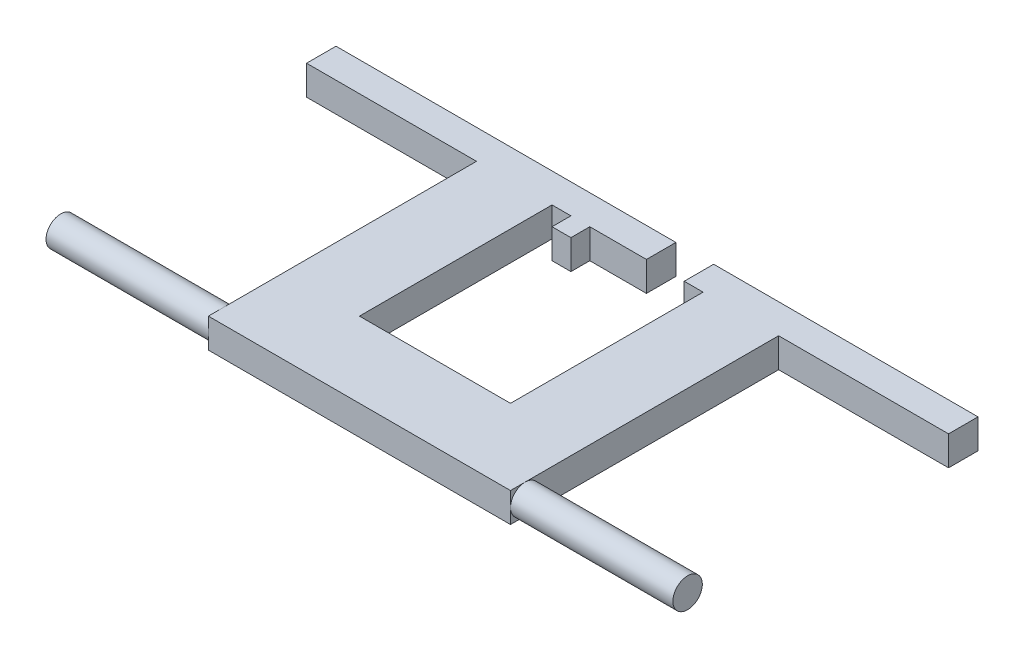
ISO-10303-21;
HEADER;
FILE_DESCRIPTION(('STEP AP214'),'2;1');
FILE_NAME('part.step','',(''),(''),'','','');
FILE_SCHEMA(('AUTOMOTIVE_DESIGN { 1 0 10303 214 1 1 1 1 }'));
ENDSEC;
DATA;
#1=APPLICATION_CONTEXT('core data for automotive mechanical design processes');
#2=APPLICATION_PROTOCOL_DEFINITION('international standard','automotive_design',2000,#1);
#3=PRODUCT_CONTEXT('',#1,'mechanical');
#4=PRODUCT('Part','Part','',(#3));
#5=PRODUCT_RELATED_PRODUCT_CATEGORY('part','',(#4));
#6=PRODUCT_DEFINITION_FORMATION('','',#4);
#7=PRODUCT_DEFINITION_CONTEXT('part definition',#1,'design');
#8=PRODUCT_DEFINITION('design','',#6,#7);
#9=PRODUCT_DEFINITION_SHAPE('','',#8);
#10=(LENGTH_UNIT() NAMED_UNIT(*) SI_UNIT(.MILLI.,.METRE.));
#11=(NAMED_UNIT(*) PLANE_ANGLE_UNIT() SI_UNIT($,.RADIAN.));
#12=(NAMED_UNIT(*) SI_UNIT($,.STERADIAN.) SOLID_ANGLE_UNIT());
#13=UNCERTAINTY_MEASURE_WITH_UNIT(LENGTH_MEASURE(1.E-05),#10,'distance_accuracy_value','');
#14=(GEOMETRIC_REPRESENTATION_CONTEXT(3) GLOBAL_UNCERTAINTY_ASSIGNED_CONTEXT((#13)) GLOBAL_UNIT_ASSIGNED_CONTEXT((#10,
#11,#12)) REPRESENTATION_CONTEXT('',''));
#15=CARTESIAN_POINT('',(0.,0.,0.));
#16=DIRECTION('',(0.,0.,1.));
#17=DIRECTION('',(1.,0.,0.));
#18=AXIS2_PLACEMENT_3D('',#15,#16,#17);
#19=CARTESIAN_POINT('',(-75.2631578947368,7.8,-5.25519897304235));
#20=DIRECTION('',(0.,0.,-1.));
#21=DIRECTION('',(-1.,0.,0.));
#22=AXIS2_PLACEMENT_3D('',#19,#20,#21);
#23=PLANE('',#22);
#24=DIRECTION('',(0.,-1.,0.));
#25=VECTOR('',#24,1.);
#26=CARTESIAN_POINT('',(-5.26315789473683,7.8,-5.25519897304235));
#27=LINE('',#26,#25);
#28=CARTESIAN_POINT('',(-5.26315789473683,7.8,-5.25519897304235));
#29=VERTEX_POINT('',#28);
#30=CARTESIAN_POINT('',(-5.26315789473683,0.,-5.25519897304235));
#31=VERTEX_POINT('',#30);
#32=EDGE_CURVE('E63',#29,#31,#27,.T.);
#33=ORIENTED_EDGE('',*,*,#32,.F.);
#34=DIRECTION('',(1.,0.,0.));
#35=VECTOR('',#34,1.);
#36=CARTESIAN_POINT('',(-75.2631578947368,7.8,-5.25519897304235));
#37=LINE('',#36,#35);
#38=CARTESIAN_POINT('',(-10.2631578947368,7.8,-5.25519897304235));
#39=VERTEX_POINT('',#38);
#40=EDGE_CURVE('E370',#39,#29,#37,.T.);
#41=ORIENTED_EDGE('',*,*,#40,.F.);
#42=DIRECTION('',(0.,1.,0.));
#43=VECTOR('',#42,1.);
#44=CARTESIAN_POINT('',(-10.2631578947368,7.8,-5.25519897304235));
#45=LINE('',#44,#43);
#46=CARTESIAN_POINT('',(-10.2631578947368,0.,-5.25519897304235));
#47=VERTEX_POINT('',#46);
#48=EDGE_CURVE('E340',#47,#39,#45,.T.);
#49=ORIENTED_EDGE('',*,*,#48,.F.);
#50=DIRECTION('',(1.,0.,0.));
#51=VECTOR('',#50,1.);
#52=CARTESIAN_POINT('',(-75.2631578947368,0.,-5.25519897304235));
#53=LINE('',#52,#51);
#54=EDGE_CURVE('E388',#47,#31,#53,.T.);
#55=ORIENTED_EDGE('',*,*,#54,.T.);
#56=EDGE_LOOP('',(#33,#41,#49,#55));
#57=FACE_BOUND('',#56,.T.);
#58=ADVANCED_FACE('F39',(#57),#23,.F.);
#59=DIRECTION('',(0.,1.,0.));
#60=VECTOR('',#59,1.);
#61=CARTESIAN_POINT('',(-0.263157894736831,7.8,-5.25519897304235));
#62=LINE('',#61,#60);
#63=CARTESIAN_POINT('',(-0.26315789473683,0.,-5.25519897304235));
#64=VERTEX_POINT('',#63);
#65=CARTESIAN_POINT('',(-0.263157894736826,7.8,-5.25519897304235));
#66=VERTEX_POINT('',#65);
#67=EDGE_CURVE('E220',#64,#66,#62,.T.);
#68=ORIENTED_EDGE('',*,*,#67,.F.);
#69=CARTESIAN_POINT('',(14.7368421052631,0.,-5.25519897304235));
#70=VERTEX_POINT('',#69);
#71=EDGE_CURVE('E389',#64,#70,#53,.T.);
#72=ORIENTED_EDGE('',*,*,#71,.T.);
#73=DIRECTION('',(0.,-1.,0.));
#74=VECTOR('',#73,1.);
#75=CARTESIAN_POINT('',(14.7368421052631,7.8,-5.25519897304235));
#76=LINE('',#75,#74);
#77=CARTESIAN_POINT('',(14.7368421052631,7.8,-5.25519897304235));
#78=VERTEX_POINT('',#77);
#79=EDGE_CURVE('E224',#78,#70,#76,.T.);
#80=ORIENTED_EDGE('',*,*,#79,.F.);
#81=EDGE_CURVE('E55',#66,#78,#37,.T.);
#82=ORIENTED_EDGE('',*,*,#81,.F.);
#83=EDGE_LOOP('',(#68,#72,#80,#82));
#84=FACE_BOUND('',#83,.T.);
#85=ADVANCED_FACE('F436',(#84),#23,.F.);
#86=CARTESIAN_POINT('',(-75.2631578947368,7.8,-13.0551989730424));
#87=DIRECTION('',(0.,0.,1.));
#88=DIRECTION('',(1.,0.,0.));
#89=AXIS2_PLACEMENT_3D('',#86,#87,#88);
#90=PLANE('',#89);
#91=DIRECTION('',(-1.,0.,0.));
#92=VECTOR('',#91,1.);
#93=CARTESIAN_POINT('',(-75.2631578947368,7.8,-13.0551989730424));
#94=LINE('',#93,#92);
#95=CARTESIAN_POINT('',(14.7368421052631,7.8,-13.0551989730424));
#96=VERTEX_POINT('',#95);
#97=CARTESIAN_POINT('',(-75.2631578947368,7.8,-13.0551989730424));
#98=VERTEX_POINT('',#97);
#99=EDGE_CURVE('E373',#96,#98,#94,.T.);
#100=ORIENTED_EDGE('',*,*,#99,.F.);
#101=DIRECTION('',(0.,-1.,0.));
#102=VECTOR('',#101,1.);
#103=CARTESIAN_POINT('',(14.7368421052631,7.8,-13.0551989730424));
#104=LINE('',#103,#102);
#105=CARTESIAN_POINT('',(14.7368421052631,0.,-13.0551989730424));
#106=VERTEX_POINT('',#105);
#107=EDGE_CURVE('E235',#96,#106,#104,.T.);
#108=ORIENTED_EDGE('',*,*,#107,.T.);
#109=DIRECTION('',(-1.,0.,0.));
#110=VECTOR('',#109,1.);
#111=CARTESIAN_POINT('',(-75.2631578947368,0.,-13.0551989730424));
#112=LINE('',#111,#110);
#113=CARTESIAN_POINT('',(-75.2631578947368,0.,-13.0551989730424));
#114=VERTEX_POINT('',#113);
#115=EDGE_CURVE('E392',#106,#114,#112,.T.);
#116=ORIENTED_EDGE('',*,*,#115,.T.);
#117=DIRECTION('',(0.,-1.,0.));
#118=VECTOR('',#117,1.);
#119=CARTESIAN_POINT('',(-75.2631578947368,7.8,-13.0551989730424));
#120=LINE('',#119,#118);
#121=EDGE_CURVE('E378',#98,#114,#120,.T.);
#122=ORIENTED_EDGE('',*,*,#121,.F.);
#123=EDGE_LOOP('',(#100,#108,#116,#122));
#124=FACE_BOUND('',#123,.T.);
#125=ADVANCED_FACE('F487',(#124),#90,.F.);
#126=CARTESIAN_POINT('',(49.7368421052635,7.8,65.7448010269574));
#127=DIRECTION('',(1.,0.,0.));
#128=DIRECTION('',(0.,0.,-1.));
#129=AXIS2_PLACEMENT_3D('',#126,#127,#128);
#130=PLANE('',#129);
#131=CARTESIAN_POINT('',(49.7368421052635,3.9,61.8448010269574));
#132=DIRECTION('',(-1.,0.,0.));
#133=DIRECTION('',(0.,0.,1.));
#134=AXIS2_PLACEMENT_3D('',#131,#132,#133);
#135=CIRCLE('',#134,3.9);
#136=CARTESIAN_POINT('',(49.7368421052635,3.9,65.7448010269574));
#137=VERTEX_POINT('',#136);
#138=CARTESIAN_POINT('',(49.7368421052635,7.8,61.8448010269574));
#139=VERTEX_POINT('',#138);
#140=EDGE_CURVE('E270',#137,#139,#135,.T.);
#141=ORIENTED_EDGE('',*,*,#140,.T.);
#142=DIRECTION('',(0.,0.,-1.));
#143=VECTOR('',#142,1.);
#144=CARTESIAN_POINT('',(49.7368421052635,7.8,65.7448010269574));
#145=LINE('',#144,#143);
#146=CARTESIAN_POINT('',(49.7368421052635,7.8,65.7448010269574));
#147=VERTEX_POINT('',#146);
#148=EDGE_CURVE('E301',#147,#139,#145,.T.);
#149=ORIENTED_EDGE('',*,*,#148,.F.);
#150=DIRECTION('',(0.,-1.,0.));
#151=VECTOR('',#150,1.);
#152=CARTESIAN_POINT('',(49.7368421052635,7.8,65.7448010269574));
#153=LINE('',#152,#151);
#154=EDGE_CURVE('E275',#147,#137,#153,.T.);
#155=ORIENTED_EDGE('',*,*,#154,.T.);
#156=EDGE_LOOP('',(#141,#149,#155));
#157=FACE_BOUND('',#156,.T.);
#158=ADVANCED_FACE('F466',(#157),#130,.T.);
#159=CARTESIAN_POINT('',(49.7368421052635,0.,61.8448010269574));
#160=VERTEX_POINT('',#159);
#161=EDGE_CURVE('E264',#160,#137,#135,.T.);
#162=ORIENTED_EDGE('',*,*,#161,.T.);
#163=CARTESIAN_POINT('',(49.7368421052635,0.,65.7448010269574));
#164=VERTEX_POINT('',#163);
#165=EDGE_CURVE('E280',#137,#164,#153,.T.);
#166=ORIENTED_EDGE('',*,*,#165,.T.);
#167=DIRECTION('',(0.,0.,-1.));
#168=VECTOR('',#167,1.);
#169=CARTESIAN_POINT('',(49.7368421052635,0.,65.7448010269574));
#170=LINE('',#169,#168);
#171=EDGE_CURVE('E288',#164,#160,#170,.T.);
#172=ORIENTED_EDGE('',*,*,#171,.T.);
#173=EDGE_LOOP('',(#162,#166,#172));
#174=FACE_BOUND('',#173,.T.);
#175=ADVANCED_FACE('F457',(#174),#130,.T.);
#176=CARTESIAN_POINT('',(49.7368421052632,7.8,-5.25519897304235));
#177=VERTEX_POINT('',#176);
#178=CARTESIAN_POINT('',(94.7368421052632,7.8,-5.25519897304235));
#179=VERTEX_POINT('',#178);
#180=EDGE_CURVE('E363',#177,#179,#37,.T.);
#181=ORIENTED_EDGE('',*,*,#180,.F.);
#182=DIRECTION('',(0.,-1.,0.));
#183=VECTOR('',#182,1.);
#184=CARTESIAN_POINT('',(49.7368421052632,7.8,-5.25519897304255));
#185=LINE('',#184,#183);
#186=CARTESIAN_POINT('',(49.7368421052632,0.,-5.25519897304255));
#187=VERTEX_POINT('',#186);
#188=EDGE_CURVE('E269',#177,#187,#185,.T.);
#189=ORIENTED_EDGE('',*,*,#188,.T.);
#190=CARTESIAN_POINT('',(94.7368421052632,0.,-5.25519897304235));
#191=VERTEX_POINT('',#190);
#192=EDGE_CURVE('E382',#187,#191,#53,.T.);
#193=ORIENTED_EDGE('',*,*,#192,.T.);
#194=DIRECTION('',(0.,-1.,0.));
#195=VECTOR('',#194,1.);
#196=CARTESIAN_POINT('',(94.7368421052632,7.8,-5.25519897304235));
#197=LINE('',#196,#195);
#198=EDGE_CURVE('E48',#179,#191,#197,.T.);
#199=ORIENTED_EDGE('',*,*,#198,.F.);
#200=EDGE_LOOP('',(#181,#189,#193,#199));
#201=FACE_BOUND('',#200,.T.);
#202=ADVANCED_FACE('F444',(#201),#23,.F.);
#203=CARTESIAN_POINT('',(-10.2631578947368,7.8,65.7448010269576));
#204=DIRECTION('',(-1.,0.,0.));
#205=DIRECTION('',(0.,-1.,0.));
#206=AXIS2_PLACEMENT_3D('',#203,#204,#205);
#207=PLANE('',#206);
#208=DIRECTION('',(0.,1.,0.));
#209=VECTOR('',#208,1.);
#210=CARTESIAN_POINT('',(-10.2631578947368,7.8,45.7448010269576));
#211=LINE('',#210,#209);
#212=CARTESIAN_POINT('',(-10.2631578947368,0.,45.7448010269576));
#213=VERTEX_POINT('',#212);
#214=CARTESIAN_POINT('',(-10.2631578947368,7.8,45.7448010269576));
#215=VERTEX_POINT('',#214);
#216=EDGE_CURVE('E304',#213,#215,#211,.T.);
#217=ORIENTED_EDGE('',*,*,#216,.F.);
#218=DIRECTION('',(0.,0.,-1.));
#219=VECTOR('',#218,1.);
#220=CARTESIAN_POINT('',(-10.2631578947368,0.,65.7448010269576));
#221=LINE('',#220,#219);
#222=EDGE_CURVE('E351',#213,#47,#221,.T.);
#223=ORIENTED_EDGE('',*,*,#222,.T.);
#224=ORIENTED_EDGE('',*,*,#48,.T.);
#225=DIRECTION('',(0.,0.,-1.));
#226=VECTOR('',#225,1.);
#227=CARTESIAN_POINT('',(-10.2631578947368,7.8,65.7448010269576));
#228=LINE('',#227,#226);
#229=EDGE_CURVE('E348',#215,#39,#228,.T.);
#230=ORIENTED_EDGE('',*,*,#229,.F.);
#231=EDGE_LOOP('',(#217,#223,#224,#230));
#232=FACE_BOUND('',#231,.T.);
#233=ADVANCED_FACE('F527',(#232),#207,.F.);
#234=CARTESIAN_POINT('',(-30.2631578947368,7.8,65.7448010269576));
#235=DIRECTION('',(1.,0.,0.));
#236=DIRECTION('',(0.,0.,-1.));
#237=AXIS2_PLACEMENT_3D('',#234,#235,#236);
#238=PLANE('',#237);
#239=CARTESIAN_POINT('',(-30.2631578947368,3.9,61.8448010269576));
#240=DIRECTION('',(-1.,0.,0.));
#241=DIRECTION('',(0.,0.,1.));
#242=AXIS2_PLACEMENT_3D('',#239,#240,#241);
#243=CIRCLE('',#242,3.9);
#244=CARTESIAN_POINT('',(-30.2631578947368,0.,61.8448010269576));
#245=VERTEX_POINT('',#244);
#246=CARTESIAN_POINT('',(-30.2631578947368,3.9,65.7448010269576));
#247=VERTEX_POINT('',#246);
#248=EDGE_CURVE('E314',#245,#247,#243,.T.);
#249=ORIENTED_EDGE('',*,*,#248,.F.);
#250=DIRECTION('',(0.,0.,-1.));
#251=VECTOR('',#250,1.);
#252=CARTESIAN_POINT('',(-30.2631578947368,0.,65.7448010269576));
#253=LINE('',#252,#251);
#254=CARTESIAN_POINT('',(-30.2631578947368,0.,65.7448010269576));
#255=VERTEX_POINT('',#254);
#256=EDGE_CURVE('E355',#255,#245,#253,.T.);
#257=ORIENTED_EDGE('',*,*,#256,.F.);
#258=DIRECTION('',(0.,-1.,0.));
#259=VECTOR('',#258,1.);
#260=CARTESIAN_POINT('',(-30.2631578947368,7.8,65.7448010269576));
#261=LINE('',#260,#259);
#262=EDGE_CURVE('E330',#247,#255,#261,.T.);
#263=ORIENTED_EDGE('',*,*,#262,.F.);
#264=EDGE_LOOP('',(#249,#257,#263));
#265=FACE_BOUND('',#264,.T.);
#266=ADVANCED_FACE('F497',(#265),#238,.F.);
#267=CARTESIAN_POINT('',(-30.2631578947368,7.8,61.8448010269576));
#268=VERTEX_POINT('',#267);
#269=EDGE_CURVE('E320',#247,#268,#243,.T.);
#270=ORIENTED_EDGE('',*,*,#269,.F.);
#271=CARTESIAN_POINT('',(-30.2631578947368,7.8,65.7448010269576));
#272=VERTEX_POINT('',#271);
#273=EDGE_CURVE('E325',#272,#247,#261,.T.);
#274=ORIENTED_EDGE('',*,*,#273,.F.);
#275=DIRECTION('',(0.,0.,-1.));
#276=VECTOR('',#275,1.);
#277=CARTESIAN_POINT('',(-30.2631578947368,7.8,65.7448010269576));
#278=LINE('',#277,#276);
#279=EDGE_CURVE('E344',#272,#268,#278,.T.);
#280=ORIENTED_EDGE('',*,*,#279,.T.);
#281=EDGE_LOOP('',(#270,#274,#280));
#282=FACE_BOUND('',#281,.T.);
#283=ADVANCED_FACE('F491',(#282),#238,.F.);
#284=DIRECTION('',(0.,-1.,0.));
#285=VECTOR('',#284,1.);
#286=CARTESIAN_POINT('',(-30.2631578947368,7.8,-5.25519897304235));
#287=LINE('',#286,#285);
#288=CARTESIAN_POINT('',(-30.2631578947368,7.8,-5.25519897304235));
#289=VERTEX_POINT('',#288);
#290=CARTESIAN_POINT('',(-30.2631578947368,0.,-5.25519897304235));
#291=VERTEX_POINT('',#290);
#292=EDGE_CURVE('E319',#289,#291,#287,.T.);
#293=ORIENTED_EDGE('',*,*,#292,.F.);
#294=CARTESIAN_POINT('',(-75.2631578947368,7.8,-5.25519897304235));
#295=VERTEX_POINT('',#294);
#296=EDGE_CURVE('E365',#295,#289,#37,.T.);
#297=ORIENTED_EDGE('',*,*,#296,.F.);
#298=DIRECTION('',(0.,-1.,0.));
#299=VECTOR('',#298,1.);
#300=CARTESIAN_POINT('',(-75.2631578947368,7.8,-5.25519897304235));
#301=LINE('',#300,#299);
#302=CARTESIAN_POINT('',(-75.2631578947368,0.,-5.25519897304235));
#303=VERTEX_POINT('',#302);
#304=EDGE_CURVE('E11',#295,#303,#301,.T.);
#305=ORIENTED_EDGE('',*,*,#304,.T.);
#306=EDGE_CURVE('E383',#303,#291,#53,.T.);
#307=ORIENTED_EDGE('',*,*,#306,.T.);
#308=EDGE_LOOP('',(#293,#297,#305,#307));
#309=FACE_BOUND('',#308,.T.);
#310=ADVANCED_FACE('F483',(#309),#23,.F.);
#311=CARTESIAN_POINT('',(24.7368421052631,7.8,-5.25519897304235));
#312=VERTEX_POINT('',#311);
#313=CARTESIAN_POINT('',(29.7368421052631,7.8,-5.25519897304235));
#314=VERTEX_POINT('',#313);
#315=EDGE_CURVE('E427',#312,#314,#37,.T.);
#316=ORIENTED_EDGE('',*,*,#315,.F.);
#317=DIRECTION('',(0.,1.,0.));
#318=VECTOR('',#317,1.);
#319=CARTESIAN_POINT('',(24.7368421052631,7.8,-5.25519897304235));
#320=LINE('',#319,#318);
#321=CARTESIAN_POINT('',(24.7368421052631,0.,-5.25519897304235));
#322=VERTEX_POINT('',#321);
#323=EDGE_CURVE('E229',#322,#312,#320,.T.);
#324=ORIENTED_EDGE('',*,*,#323,.F.);
#325=CARTESIAN_POINT('',(29.7368421052631,0.,-5.25519897304235));
#326=VERTEX_POINT('',#325);
#327=EDGE_CURVE('E438',#322,#326,#53,.T.);
#328=ORIENTED_EDGE('',*,*,#327,.T.);
#329=DIRECTION('',(0.,1.,0.));
#330=VECTOR('',#329,1.);
#331=CARTESIAN_POINT('',(29.7368421052632,7.8,-5.25519897304245));
#332=LINE('',#331,#330);
#333=EDGE_CURVE('E284',#326,#314,#332,.T.);
#334=ORIENTED_EDGE('',*,*,#333,.T.);
#335=EDGE_LOOP('',(#316,#324,#328,#334));
#336=FACE_BOUND('',#335,.T.);
#337=ADVANCED_FACE('F490',(#336),#23,.F.);
#338=CARTESIAN_POINT('',(-75.2631578947368,7.8,-13.0551989730424));
#339=DIRECTION('',(1.,0.,0.));
#340=DIRECTION('',(0.,0.,-1.));
#341=AXIS2_PLACEMENT_3D('',#338,#339,#340);
#342=PLANE('',#341);
#343=DIRECTION('',(0.,0.,1.));
#344=VECTOR('',#343,1.);
#345=CARTESIAN_POINT('',(-75.2631578947368,0.,-13.0551989730424));
#346=LINE('',#345,#344);
#347=EDGE_CURVE('E358',#114,#303,#346,.T.);
#348=ORIENTED_EDGE('',*,*,#347,.T.);
#349=ORIENTED_EDGE('',*,*,#304,.F.);
#350=DIRECTION('',(0.,0.,1.));
#351=VECTOR('',#350,1.);
#352=CARTESIAN_POINT('',(-75.2631578947368,7.8,-13.0551989730424));
#353=LINE('',#352,#351);
#354=EDGE_CURVE('E359',#98,#295,#353,.T.);
#355=ORIENTED_EDGE('',*,*,#354,.F.);
#356=ORIENTED_EDGE('',*,*,#121,.T.);
#357=EDGE_LOOP('',(#348,#349,#355,#356));
#358=FACE_BOUND('',#357,.T.);
#359=ADVANCED_FACE('F41',(#358),#342,.F.);
#360=CARTESIAN_POINT('',(94.7368421052632,7.8,-13.0551989730424));
#361=DIRECTION('',(-1.,0.,0.));
#362=DIRECTION('',(0.,0.,1.));
#363=AXIS2_PLACEMENT_3D('',#360,#361,#362);
#364=PLANE('',#363);
#365=DIRECTION('',(0.,0.,-1.));
#366=VECTOR('',#365,1.);
#367=CARTESIAN_POINT('',(94.7368421052632,0.,-13.0551989730424));
#368=LINE('',#367,#366);
#369=CARTESIAN_POINT('',(94.7368421052632,0.,-13.0551989730424));
#370=VERTEX_POINT('',#369);
#371=EDGE_CURVE('E387',#191,#370,#368,.T.);
#372=ORIENTED_EDGE('',*,*,#371,.T.);
#373=DIRECTION('',(0.,-1.,0.));
#374=VECTOR('',#373,1.);
#375=CARTESIAN_POINT('',(94.7368421052632,7.8,-13.0551989730424));
#376=LINE('',#375,#374);
#377=CARTESIAN_POINT('',(94.7368421052632,7.8,-13.0551989730424));
#378=VERTEX_POINT('',#377);
#379=EDGE_CURVE('E399',#378,#370,#376,.T.);
#380=ORIENTED_EDGE('',*,*,#379,.F.);
#381=DIRECTION('',(0.,0.,-1.));
#382=VECTOR('',#381,1.);
#383=CARTESIAN_POINT('',(94.7368421052632,7.8,-13.0551989730424));
#384=LINE('',#383,#382);
#385=EDGE_CURVE('E369',#179,#378,#384,.T.);
#386=ORIENTED_EDGE('',*,*,#385,.F.);
#387=ORIENTED_EDGE('',*,*,#198,.T.);
#388=EDGE_LOOP('',(#372,#380,#386,#387));
#389=FACE_BOUND('',#388,.T.);
#390=ADVANCED_FACE('F408',(#389),#364,.F.);
#391=CARTESIAN_POINT('',(24.7368421052631,0.,-13.0551989730424));
#392=VERTEX_POINT('',#391);
#393=EDGE_CURVE('E364',#370,#392,#112,.T.);
#394=ORIENTED_EDGE('',*,*,#393,.T.);
#395=DIRECTION('',(0.,1.,0.));
#396=VECTOR('',#395,1.);
#397=CARTESIAN_POINT('',(24.7368421052631,7.8,-13.0551989730424));
#398=LINE('',#397,#396);
#399=CARTESIAN_POINT('',(24.7368421052631,7.8,-13.0551989730424));
#400=VERTEX_POINT('',#399);
#401=EDGE_CURVE('E239',#392,#400,#398,.T.);
#402=ORIENTED_EDGE('',*,*,#401,.T.);
#403=EDGE_CURVE('E374',#378,#400,#94,.T.);
#404=ORIENTED_EDGE('',*,*,#403,.F.);
#405=ORIENTED_EDGE('',*,*,#379,.T.);
#406=EDGE_LOOP('',(#394,#402,#404,#405));
#407=FACE_BOUND('',#406,.T.);
#408=ADVANCED_FACE('F418',(#407),#90,.F.);
#409=CARTESIAN_POINT('',(0.,7.8,0.));
#410=DIRECTION('',(0.,1.,0.));
#411=DIRECTION('',(0.,0.,1.));
#412=AXIS2_PLACEMENT_3D('',#409,#410,#411);
#413=PLANE('',#412);
#414=DIRECTION('',(0.,0.,1.));
#415=VECTOR('',#414,1.);
#416=CARTESIAN_POINT('',(14.7368421052631,7.8,-13.0551989730424));
#417=LINE('',#416,#415);
#418=EDGE_CURVE('E246',#96,#78,#417,.T.);
#419=ORIENTED_EDGE('',*,*,#418,.F.);
#420=ORIENTED_EDGE('',*,*,#99,.T.);
#421=ORIENTED_EDGE('',*,*,#354,.T.);
#422=ORIENTED_EDGE('',*,*,#296,.T.);
#423=EDGE_CURVE('E336',#268,#289,#278,.T.);
#424=ORIENTED_EDGE('',*,*,#423,.F.);
#425=ORIENTED_EDGE('',*,*,#279,.F.);
#426=DIRECTION('',(-1.,0.,0.));
#427=VECTOR('',#426,1.);
#428=CARTESIAN_POINT('',(-30.2631578947368,7.8,65.7448010269576));
#429=LINE('',#428,#427);
#430=EDGE_CURVE('E333',#147,#272,#429,.T.);
#431=ORIENTED_EDGE('',*,*,#430,.F.);
#432=ORIENTED_EDGE('',*,*,#148,.T.);
#433=EDGE_CURVE('E300',#139,#177,#145,.T.);
#434=ORIENTED_EDGE('',*,*,#433,.T.);
#435=ORIENTED_EDGE('',*,*,#180,.T.);
#436=ORIENTED_EDGE('',*,*,#385,.T.);
#437=ORIENTED_EDGE('',*,*,#403,.T.);
#438=DIRECTION('',(0.,0.,1.));
#439=VECTOR('',#438,1.);
#440=CARTESIAN_POINT('',(24.7368421052631,7.8,-13.0551989730424));
#441=LINE('',#440,#439);
#442=EDGE_CURVE('E251',#400,#312,#441,.T.);
#443=ORIENTED_EDGE('',*,*,#442,.T.);
#444=ORIENTED_EDGE('',*,*,#315,.T.);
#445=DIRECTION('',(0.,0.,-1.));
#446=VECTOR('',#445,1.);
#447=CARTESIAN_POINT('',(29.7368421052635,7.8,65.7448010269575));
#448=LINE('',#447,#446);
#449=CARTESIAN_POINT('',(29.7368421052634,7.8,45.7448010269575));
#450=VERTEX_POINT('',#449);
#451=EDGE_CURVE('E296',#450,#314,#448,.T.);
#452=ORIENTED_EDGE('',*,*,#451,.F.);
#453=DIRECTION('',(-1.,0.,0.));
#454=VECTOR('',#453,1.);
#455=CARTESIAN_POINT('',(14.7368421052632,7.8,45.7448010269576));
#456=LINE('',#455,#454);
#457=EDGE_CURVE('E308',#450,#215,#456,.T.);
#458=ORIENTED_EDGE('',*,*,#457,.T.);
#459=ORIENTED_EDGE('',*,*,#229,.T.);
#460=ORIENTED_EDGE('',*,*,#40,.T.);
#461=DIRECTION('',(0.,0.,-1.));
#462=VECTOR('',#461,1.);
#463=CARTESIAN_POINT('',(-5.26315789473683,7.8,-0.255198973042354));
#464=LINE('',#463,#462);
#465=CARTESIAN_POINT('',(-5.26315789473683,7.8,-0.255198973042354));
#466=VERTEX_POINT('',#465);
#467=EDGE_CURVE('E646',#466,#29,#464,.T.);
#468=ORIENTED_EDGE('',*,*,#467,.F.);
#469=DIRECTION('',(-1.,0.,0.));
#470=VECTOR('',#469,1.);
#471=CARTESIAN_POINT('',(-5.26315789473683,7.8,-0.255198973042354));
#472=LINE('',#471,#470);
#473=CARTESIAN_POINT('',(-0.263157894736831,7.8,-0.255198973042354));
#474=VERTEX_POINT('',#473);
#475=EDGE_CURVE('E215',#474,#466,#472,.T.);
#476=ORIENTED_EDGE('',*,*,#475,.F.);
#477=DIRECTION('',(0.,0.,-1.));
#478=VECTOR('',#477,1.);
#479=CARTESIAN_POINT('',(-0.263157894736831,7.8,-0.255198973042354));
#480=LINE('',#479,#478);
#481=EDGE_CURVE('E231',#474,#66,#480,.T.);
#482=ORIENTED_EDGE('',*,*,#481,.T.);
#483=ORIENTED_EDGE('',*,*,#81,.T.);
#484=EDGE_LOOP('',(#419,#420,#421,#422,#424,#425,#431,#432,#434,#435,#436,#437,#443,#444,#452,
#458,#459,#460,#468,#476,#482,#483));
#485=FACE_BOUND('',#484,.T.);
#486=ADVANCED_FACE('F422',(#485),#413,.T.);
#487=CARTESIAN_POINT('',(0.,0.,0.));
#488=DIRECTION('',(0.,1.,0.));
#489=DIRECTION('',(0.,0.,1.));
#490=AXIS2_PLACEMENT_3D('',#487,#488,#489);
#491=PLANE('',#490);
#492=ORIENTED_EDGE('',*,*,#115,.F.);
#493=DIRECTION('',(0.,0.,1.));
#494=VECTOR('',#493,1.);
#495=CARTESIAN_POINT('',(14.7368421052631,0.,-13.0551989730424));
#496=LINE('',#495,#494);
#497=EDGE_CURVE('E242',#106,#70,#496,.T.);
#498=ORIENTED_EDGE('',*,*,#497,.T.);
#499=ORIENTED_EDGE('',*,*,#71,.F.);
#500=DIRECTION('',(0.,0.,-1.));
#501=VECTOR('',#500,1.);
#502=CARTESIAN_POINT('',(-0.26315789473683,0.,-0.255198973042354));
#503=LINE('',#502,#501);
#504=CARTESIAN_POINT('',(-0.26315789473683,0.,-0.255198973042354));
#505=VERTEX_POINT('',#504);
#506=EDGE_CURVE('E205',#505,#64,#503,.T.);
#507=ORIENTED_EDGE('',*,*,#506,.F.);
#508=DIRECTION('',(1.,0.,0.));
#509=VECTOR('',#508,1.);
#510=CARTESIAN_POINT('',(-5.26315789473683,0.,-0.255198973042354));
#511=LINE('',#510,#509);
#512=CARTESIAN_POINT('',(-5.26315789473683,0.,-0.255198973042354));
#513=VERTEX_POINT('',#512);
#514=EDGE_CURVE('E197',#513,#505,#511,.T.);
#515=ORIENTED_EDGE('',*,*,#514,.F.);
#516=DIRECTION('',(0.,0.,-1.));
#517=VECTOR('',#516,1.);
#518=CARTESIAN_POINT('',(-5.26315789473683,0.,-0.255198973042354));
#519=LINE('',#518,#517);
#520=EDGE_CURVE('E203',#513,#31,#519,.T.);
#521=ORIENTED_EDGE('',*,*,#520,.T.);
#522=ORIENTED_EDGE('',*,*,#54,.F.);
#523=ORIENTED_EDGE('',*,*,#222,.F.);
#524=DIRECTION('',(-1.,0.,0.));
#525=VECTOR('',#524,1.);
#526=CARTESIAN_POINT('',(14.7368421052632,0.,45.7448010269576));
#527=LINE('',#526,#525);
#528=CARTESIAN_POINT('',(29.7368421052634,0.,45.7448010269575));
#529=VERTEX_POINT('',#528);
#530=EDGE_CURVE('E311',#529,#213,#527,.T.);
#531=ORIENTED_EDGE('',*,*,#530,.F.);
#532=DIRECTION('',(0.,0.,-1.));
#533=VECTOR('',#532,1.);
#534=CARTESIAN_POINT('',(29.7368421052635,0.,65.7448010269575));
#535=LINE('',#534,#533);
#536=EDGE_CURVE('E292',#529,#326,#535,.T.);
#537=ORIENTED_EDGE('',*,*,#536,.T.);
#538=ORIENTED_EDGE('',*,*,#327,.F.);
#539=DIRECTION('',(0.,0.,1.));
#540=VECTOR('',#539,1.);
#541=CARTESIAN_POINT('',(24.7368421052631,0.,-13.0551989730424));
#542=LINE('',#541,#540);
#543=EDGE_CURVE('E255',#392,#322,#542,.T.);
#544=ORIENTED_EDGE('',*,*,#543,.F.);
#545=ORIENTED_EDGE('',*,*,#393,.F.);
#546=ORIENTED_EDGE('',*,*,#371,.F.);
#547=ORIENTED_EDGE('',*,*,#192,.F.);
#548=EDGE_CURVE('E279',#160,#187,#170,.T.);
#549=ORIENTED_EDGE('',*,*,#548,.F.);
#550=ORIENTED_EDGE('',*,*,#171,.F.);
#551=DIRECTION('',(1.,0.,0.));
#552=VECTOR('',#551,1.);
#553=CARTESIAN_POINT('',(-30.2631578947368,0.,65.7448010269576));
#554=LINE('',#553,#552);
#555=EDGE_CURVE('E329',#255,#164,#554,.T.);
#556=ORIENTED_EDGE('',*,*,#555,.F.);
#557=ORIENTED_EDGE('',*,*,#256,.T.);
#558=EDGE_CURVE('E354',#245,#291,#253,.T.);
#559=ORIENTED_EDGE('',*,*,#558,.T.);
#560=ORIENTED_EDGE('',*,*,#306,.F.);
#561=ORIENTED_EDGE('',*,*,#347,.F.);
#562=EDGE_LOOP('',(#492,#498,#499,#507,#515,#521,#522,#523,#531,#537,#538,#544,#545,#546,#547,
#549,#550,#556,#557,#559,#560,#561));
#563=FACE_BOUND('',#562,.T.);
#564=ADVANCED_FACE('F200',(#563),#491,.F.);
#565=EDGE_CURVE('E324',#268,#245,#243,.T.);
#566=ORIENTED_EDGE('',*,*,#565,.F.);
#567=ORIENTED_EDGE('',*,*,#423,.T.);
#568=ORIENTED_EDGE('',*,*,#292,.T.);
#569=ORIENTED_EDGE('',*,*,#558,.F.);
#570=EDGE_LOOP('',(#566,#567,#568,#569));
#571=FACE_BOUND('',#570,.T.);
#572=ADVANCED_FACE('F500',(#571),#238,.F.);
#573=CARTESIAN_POINT('',(0.,0.,65.7448010269576));
#574=DIRECTION('',(0.,0.,1.));
#575=DIRECTION('',(1.,0.,0.));
#576=AXIS2_PLACEMENT_3D('',#573,#574,#575);
#577=PLANE('',#576);
#578=ORIENTED_EDGE('',*,*,#555,.T.);
#579=ORIENTED_EDGE('',*,*,#165,.F.);
#580=ORIENTED_EDGE('',*,*,#154,.F.);
#581=ORIENTED_EDGE('',*,*,#430,.T.);
#582=ORIENTED_EDGE('',*,*,#273,.T.);
#583=ORIENTED_EDGE('',*,*,#262,.T.);
#584=EDGE_LOOP('',(#578,#579,#580,#581,#582,#583));
#585=FACE_BOUND('',#584,.T.);
#586=ADVANCED_FACE('F462',(#585),#577,.T.);
#587=CARTESIAN_POINT('',(-73.2631578947368,3.9,61.8448010269576));
#588=DIRECTION('',(1.,0.,0.));
#589=DIRECTION('',(0.,0.,-1.));
#590=AXIS2_PLACEMENT_3D('',#587,#588,#589);
#591=CYLINDRICAL_SURFACE('',#590,3.9);
#592=CARTESIAN_POINT('',(-73.2631578947368,3.9,61.8448010269576));
#593=DIRECTION('',(-1.,0.,0.));
#594=DIRECTION('',(0.,0.,1.));
#595=AXIS2_PLACEMENT_3D('',#592,#593,#594);
#596=CIRCLE('',#595,3.9);
#597=CARTESIAN_POINT('',(-73.2631578947368,3.9,65.7448010269576));
#598=VERTEX_POINT('',#597);
#599=EDGE_CURVE('E315',#598,#598,#596,.T.);
#600=ORIENTED_EDGE('',*,*,#599,.F.);
#601=EDGE_LOOP('',(#600));
#602=FACE_BOUND('',#601,.T.);
#603=ORIENTED_EDGE('',*,*,#269,.T.);
#604=ORIENTED_EDGE('',*,*,#565,.T.);
#605=ORIENTED_EDGE('',*,*,#248,.T.);
#606=EDGE_LOOP('',(#603,#604,#605));
#607=FACE_BOUND('',#606,.T.);
#608=ADVANCED_FACE('F522',(#602,#607),#591,.T.);
#609=CARTESIAN_POINT('',(-73.2631578947368,3.9,61.8448010269576));
#610=DIRECTION('',(-1.,0.,0.));
#611=DIRECTION('',(0.,0.,1.));
#612=AXIS2_PLACEMENT_3D('',#609,#610,#611);
#613=PLANE('',#612);
#614=ORIENTED_EDGE('',*,*,#599,.T.);
#615=EDGE_LOOP('',(#614));
#616=FACE_BOUND('',#615,.T.);
#617=ADVANCED_FACE('F680',(#616),#613,.T.);
#618=CARTESIAN_POINT('',(14.7368421052632,7.8,45.7448010269576));
#619=DIRECTION('',(0.,0.,1.));
#620=DIRECTION('',(1.,0.,0.));
#621=AXIS2_PLACEMENT_3D('',#618,#619,#620);
#622=PLANE('',#621);
#623=ORIENTED_EDGE('',*,*,#216,.T.);
#624=ORIENTED_EDGE('',*,*,#457,.F.);
#625=DIRECTION('',(0.,1.,0.));
#626=VECTOR('',#625,1.);
#627=CARTESIAN_POINT('',(29.7368421052634,7.8,45.7448010269575));
#628=LINE('',#627,#626);
#629=EDGE_CURVE('E250',#529,#450,#628,.T.);
#630=ORIENTED_EDGE('',*,*,#629,.F.);
#631=ORIENTED_EDGE('',*,*,#530,.T.);
#632=EDGE_LOOP('',(#623,#624,#630,#631));
#633=FACE_BOUND('',#632,.T.);
#634=ADVANCED_FACE('F675',(#633),#622,.F.);
#635=EDGE_CURVE('E274',#139,#160,#135,.T.);
#636=ORIENTED_EDGE('',*,*,#635,.T.);
#637=ORIENTED_EDGE('',*,*,#548,.T.);
#638=ORIENTED_EDGE('',*,*,#188,.F.);
#639=ORIENTED_EDGE('',*,*,#433,.F.);
#640=EDGE_LOOP('',(#636,#637,#638,#639));
#641=FACE_BOUND('',#640,.T.);
#642=ADVANCED_FACE('F446',(#641),#130,.T.);
#643=CARTESIAN_POINT('',(29.7368421052635,7.8,65.7448010269575));
#644=DIRECTION('',(-1.,0.,0.));
#645=DIRECTION('',(0.,0.,1.));
#646=AXIS2_PLACEMENT_3D('',#643,#644,#645);
#647=PLANE('',#646);
#648=ORIENTED_EDGE('',*,*,#629,.T.);
#649=ORIENTED_EDGE('',*,*,#451,.T.);
#650=ORIENTED_EDGE('',*,*,#333,.F.);
#651=ORIENTED_EDGE('',*,*,#536,.F.);
#652=EDGE_LOOP('',(#648,#649,#650,#651));
#653=FACE_BOUND('',#652,.T.);
#654=ADVANCED_FACE('F470',(#653),#647,.T.);
#655=CARTESIAN_POINT('',(92.7368421052635,3.9,61.8448010269572));
#656=DIRECTION('',(-1.,0.,0.));
#657=DIRECTION('',(0.,0.,1.));
#658=AXIS2_PLACEMENT_3D('',#655,#656,#657);
#659=CYLINDRICAL_SURFACE('',#658,3.9);
#660=CARTESIAN_POINT('',(92.7368421052635,3.9,61.8448010269572));
#661=DIRECTION('',(-1.,0.,0.));
#662=DIRECTION('',(0.,0.,1.));
#663=AXIS2_PLACEMENT_3D('',#660,#661,#662);
#664=CIRCLE('',#663,3.9);
#665=CARTESIAN_POINT('',(92.7368421052635,3.9,65.7448010269572));
#666=VERTEX_POINT('',#665);
#667=EDGE_CURVE('E265',#666,#666,#664,.T.);
#668=ORIENTED_EDGE('',*,*,#667,.T.);
#669=EDGE_LOOP('',(#668));
#670=FACE_BOUND('',#669,.T.);
#671=ORIENTED_EDGE('',*,*,#140,.F.);
#672=ORIENTED_EDGE('',*,*,#161,.F.);
#673=ORIENTED_EDGE('',*,*,#635,.F.);
#674=EDGE_LOOP('',(#671,#672,#673));
#675=FACE_BOUND('',#674,.T.);
#676=ADVANCED_FACE('F467',(#670,#675),#659,.T.);
#677=CARTESIAN_POINT('',(92.7368421052635,3.9,61.8448010269572));
#678=DIRECTION('',(1.,0.,0.));
#679=DIRECTION('',(0.,0.,1.));
#680=AXIS2_PLACEMENT_3D('',#677,#678,#679);
#681=PLANE('',#680);
#682=ORIENTED_EDGE('',*,*,#667,.F.);
#683=EDGE_LOOP('',(#682));
#684=FACE_BOUND('',#683,.T.);
#685=ADVANCED_FACE('F469',(#684),#681,.T.);
#686=CARTESIAN_POINT('',(24.7368421052631,7.8,-13.0551989730424));
#687=DIRECTION('',(1.,0.,0.));
#688=DIRECTION('',(0.,1.,0.));
#689=AXIS2_PLACEMENT_3D('',#686,#687,#688);
#690=PLANE('',#689);
#691=ORIENTED_EDGE('',*,*,#323,.T.);
#692=ORIENTED_EDGE('',*,*,#442,.F.);
#693=ORIENTED_EDGE('',*,*,#401,.F.);
#694=ORIENTED_EDGE('',*,*,#543,.T.);
#695=EDGE_LOOP('',(#691,#692,#693,#694));
#696=FACE_BOUND('',#695,.T.);
#697=ADVANCED_FACE('F477',(#696),#690,.F.);
#698=CARTESIAN_POINT('',(14.7368421052631,7.8,-13.0551989730424));
#699=DIRECTION('',(-1.,0.,0.));
#700=DIRECTION('',(0.,-1.,0.));
#701=AXIS2_PLACEMENT_3D('',#698,#699,#700);
#702=PLANE('',#701);
#703=ORIENTED_EDGE('',*,*,#79,.T.);
#704=ORIENTED_EDGE('',*,*,#497,.F.);
#705=ORIENTED_EDGE('',*,*,#107,.F.);
#706=ORIENTED_EDGE('',*,*,#418,.T.);
#707=EDGE_LOOP('',(#703,#704,#705,#706));
#708=FACE_BOUND('',#707,.T.);
#709=ADVANCED_FACE('F435',(#708),#702,.F.);
#710=CARTESIAN_POINT('',(-5.26315789473683,7.8,-0.255198973042354));
#711=DIRECTION('',(1.,0.,0.));
#712=DIRECTION('',(0.,1.,0.));
#713=AXIS2_PLACEMENT_3D('',#710,#711,#712);
#714=PLANE('',#713);
#715=ORIENTED_EDGE('',*,*,#32,.T.);
#716=ORIENTED_EDGE('',*,*,#520,.F.);
#717=DIRECTION('',(0.,-1.,0.));
#718=VECTOR('',#717,1.);
#719=CARTESIAN_POINT('',(-5.26315789473683,7.8,-0.255198973042354));
#720=LINE('',#719,#718);
#721=EDGE_CURVE('E210',#466,#513,#720,.T.);
#722=ORIENTED_EDGE('',*,*,#721,.F.);
#723=ORIENTED_EDGE('',*,*,#467,.T.);
#724=EDGE_LOOP('',(#715,#716,#722,#723));
#725=FACE_BOUND('',#724,.T.);
#726=ADVANCED_FACE('F222',(#725),#714,.F.);
#727=CARTESIAN_POINT('',(-0.263157894736831,7.8,-0.255198973042354));
#728=DIRECTION('',(-1.,0.,0.));
#729=DIRECTION('',(0.,-1.,0.));
#730=AXIS2_PLACEMENT_3D('',#727,#728,#729);
#731=PLANE('',#730);
#732=ORIENTED_EDGE('',*,*,#67,.T.);
#733=ORIENTED_EDGE('',*,*,#481,.F.);
#734=DIRECTION('',(0.,1.,0.));
#735=VECTOR('',#734,1.);
#736=CARTESIAN_POINT('',(-0.263157894736831,7.8,-0.255198973042354));
#737=LINE('',#736,#735);
#738=EDGE_CURVE('E209',#505,#474,#737,.T.);
#739=ORIENTED_EDGE('',*,*,#738,.F.);
#740=ORIENTED_EDGE('',*,*,#506,.T.);
#741=EDGE_LOOP('',(#732,#733,#739,#740));
#742=FACE_BOUND('',#741,.T.);
#743=ADVANCED_FACE('F619',(#742),#731,.F.);
#744=CARTESIAN_POINT('',(0.,0.,-0.255198973042354));
#745=DIRECTION('',(0.,0.,1.));
#746=DIRECTION('',(1.,0.,0.));
#747=AXIS2_PLACEMENT_3D('',#744,#745,#746);
#748=PLANE('',#747);
#749=ORIENTED_EDGE('',*,*,#721,.T.);
#750=ORIENTED_EDGE('',*,*,#514,.T.);
#751=ORIENTED_EDGE('',*,*,#738,.T.);
#752=ORIENTED_EDGE('',*,*,#475,.T.);
#753=EDGE_LOOP('',(#749,#750,#751,#752));
#754=FACE_BOUND('',#753,.T.);
#755=ADVANCED_FACE('F213',(#754),#748,.T.);
#756=CLOSED_SHELL('',(#58,#85,#125,#158,#175,#202,#233,#266,#283,#310,#337,#359,#390,#408,#486,
#564,#572,#586,#608,#617,#634,#642,#654,#676,#685,#697,#709,#726,#743,#755));
#757=MANIFOLD_SOLID_BREP('B2',#756);
#758=ADVANCED_BREP_SHAPE_REPRESENTATION('',(#18,#757),#14);
#759=SHAPE_DEFINITION_REPRESENTATION(#9,#758);
ENDSEC;
END-ISO-10303-21;
